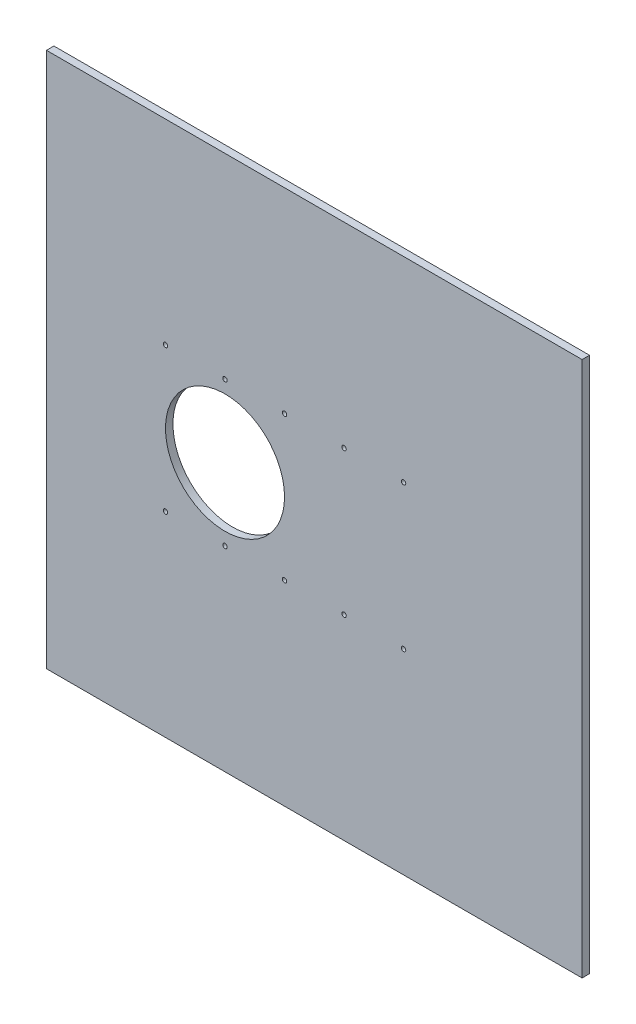
ISO-10303-21;
HEADER;
FILE_DESCRIPTION(('STEP AP214'),'2;1');
FILE_NAME('part.step','',(''),(''),'','','');
FILE_SCHEMA(('AUTOMOTIVE_DESIGN { 1 0 10303 214 1 1 1 1 }'));
ENDSEC;
DATA;
#1=APPLICATION_CONTEXT('core data for automotive mechanical design processes');
#2=APPLICATION_PROTOCOL_DEFINITION('international standard','automotive_design',2000,#1);
#3=PRODUCT_CONTEXT('',#1,'mechanical');
#4=PRODUCT('Part','Part','',(#3));
#5=PRODUCT_RELATED_PRODUCT_CATEGORY('part','',(#4));
#6=PRODUCT_DEFINITION_FORMATION('','',#4);
#7=PRODUCT_DEFINITION_CONTEXT('part definition',#1,'design');
#8=PRODUCT_DEFINITION('design','',#6,#7);
#9=PRODUCT_DEFINITION_SHAPE('','',#8);
#10=(LENGTH_UNIT() NAMED_UNIT(*) SI_UNIT(.MILLI.,.METRE.));
#11=(NAMED_UNIT(*) PLANE_ANGLE_UNIT() SI_UNIT($,.RADIAN.));
#12=(NAMED_UNIT(*) SI_UNIT($,.STERADIAN.) SOLID_ANGLE_UNIT());
#13=UNCERTAINTY_MEASURE_WITH_UNIT(LENGTH_MEASURE(1.E-05),#10,'distance_accuracy_value','');
#14=(GEOMETRIC_REPRESENTATION_CONTEXT(3) GLOBAL_UNCERTAINTY_ASSIGNED_CONTEXT((#13)) GLOBAL_UNIT_ASSIGNED_CONTEXT((#10,
#11,#12)) REPRESENTATION_CONTEXT('',''));
#15=CARTESIAN_POINT('',(0.,0.,0.));
#16=DIRECTION('',(0.,0.,1.));
#17=DIRECTION('',(1.,0.,0.));
#18=AXIS2_PLACEMENT_3D('',#15,#16,#17);
#19=CARTESIAN_POINT('',(0.,0.,6.35));
#20=DIRECTION('',(0.,0.,-1.));
#21=DIRECTION('',(-1.,0.,0.));
#22=AXIS2_PLACEMENT_3D('',#19,#20,#21);
#23=PLANE('',#22);
#24=CARTESIAN_POINT('',(101.6,290.195,6.35));
#25=DIRECTION('',(0.,0.,-1.));
#26=DIRECTION('',(-1.,0.,0.));
#27=AXIS2_PLACEMENT_3D('',#24,#25,#26);
#28=CIRCLE('',#27,1.89865);
#29=CARTESIAN_POINT('',(99.70135,290.195,6.35));
#30=VERTEX_POINT('',#29);
#31=EDGE_CURVE('E244',#30,#30,#28,.T.);
#32=ORIENTED_EDGE('',*,*,#31,.T.);
#33=EDGE_LOOP('',(#32));
#34=FACE_BOUND('',#33,.T.);
#35=CARTESIAN_POINT('',(152.4,290.195,6.35));
#36=DIRECTION('',(0.,0.,-1.));
#37=DIRECTION('',(-1.,0.,0.));
#38=AXIS2_PLACEMENT_3D('',#35,#36,#37);
#39=CIRCLE('',#38,1.89865);
#40=CARTESIAN_POINT('',(150.50135,290.195,6.35));
#41=VERTEX_POINT('',#40);
#42=EDGE_CURVE('E232',#41,#41,#39,.T.);
#43=ORIENTED_EDGE('',*,*,#42,.T.);
#44=EDGE_LOOP('',(#43));
#45=FACE_BOUND('',#44,.T.);
#46=CARTESIAN_POINT('',(203.2,290.195,6.35));
#47=DIRECTION('',(0.,0.,-1.));
#48=DIRECTION('',(-1.,0.,0.));
#49=AXIS2_PLACEMENT_3D('',#46,#47,#48);
#50=CIRCLE('',#49,1.89865);
#51=CARTESIAN_POINT('',(201.30135,290.195,6.35));
#52=VERTEX_POINT('',#51);
#53=EDGE_CURVE('E220',#52,#52,#50,.T.);
#54=ORIENTED_EDGE('',*,*,#53,.T.);
#55=EDGE_LOOP('',(#54));
#56=FACE_BOUND('',#55,.T.);
#57=CARTESIAN_POINT('',(203.2,167.005,6.35));
#58=DIRECTION('',(0.,0.,-1.));
#59=DIRECTION('',(-1.,0.,0.));
#60=AXIS2_PLACEMENT_3D('',#57,#58,#59);
#61=CIRCLE('',#60,1.89865);
#62=CARTESIAN_POINT('',(201.30135,167.005,6.35));
#63=VERTEX_POINT('',#62);
#64=EDGE_CURVE('E208',#63,#63,#61,.T.);
#65=ORIENTED_EDGE('',*,*,#64,.T.);
#66=EDGE_LOOP('',(#65));
#67=FACE_BOUND('',#66,.T.);
#68=CARTESIAN_POINT('',(152.4,167.005,6.35));
#69=DIRECTION('',(0.,0.,-1.));
#70=DIRECTION('',(-1.,0.,0.));
#71=AXIS2_PLACEMENT_3D('',#68,#69,#70);
#72=CIRCLE('',#71,1.89865);
#73=CARTESIAN_POINT('',(150.50135,167.005,6.35));
#74=VERTEX_POINT('',#73);
#75=EDGE_CURVE('E196',#74,#74,#72,.T.);
#76=ORIENTED_EDGE('',*,*,#75,.T.);
#77=EDGE_LOOP('',(#76));
#78=FACE_BOUND('',#77,.T.);
#79=CARTESIAN_POINT('',(101.6,167.005,6.35));
#80=DIRECTION('',(0.,0.,-1.));
#81=DIRECTION('',(-1.,0.,0.));
#82=AXIS2_PLACEMENT_3D('',#79,#80,#81);
#83=CIRCLE('',#82,1.89865);
#84=CARTESIAN_POINT('',(99.70135,167.005,6.35));
#85=VERTEX_POINT('',#84);
#86=EDGE_CURVE('E184',#85,#85,#83,.T.);
#87=ORIENTED_EDGE('',*,*,#86,.T.);
#88=EDGE_LOOP('',(#87));
#89=FACE_BOUND('',#88,.T.);
#90=CARTESIAN_POINT('',(254.,290.195,6.35));
#91=DIRECTION('',(0.,0.,-1.));
#92=DIRECTION('',(-1.,0.,0.));
#93=AXIS2_PLACEMENT_3D('',#90,#91,#92);
#94=CIRCLE('',#93,1.89865);
#95=CARTESIAN_POINT('',(252.10135,290.195,6.35));
#96=VERTEX_POINT('',#95);
#97=EDGE_CURVE('E172',#96,#96,#94,.T.);
#98=ORIENTED_EDGE('',*,*,#97,.T.);
#99=EDGE_LOOP('',(#98));
#100=FACE_BOUND('',#99,.T.);
#101=CARTESIAN_POINT('',(304.8,290.195,6.35));
#102=DIRECTION('',(0.,0.,-1.));
#103=DIRECTION('',(-1.,0.,0.));
#104=AXIS2_PLACEMENT_3D('',#101,#102,#103);
#105=CIRCLE('',#104,1.89865);
#106=CARTESIAN_POINT('',(302.90135,290.195,6.35));
#107=VERTEX_POINT('',#106);
#108=EDGE_CURVE('E160',#107,#107,#105,.T.);
#109=ORIENTED_EDGE('',*,*,#108,.T.);
#110=EDGE_LOOP('',(#109));
#111=FACE_BOUND('',#110,.T.);
#112=CARTESIAN_POINT('',(304.8,167.005,6.35));
#113=DIRECTION('',(0.,0.,-1.));
#114=DIRECTION('',(-1.,0.,0.));
#115=AXIS2_PLACEMENT_3D('',#112,#113,#114);
#116=CIRCLE('',#115,1.89865);
#117=CARTESIAN_POINT('',(302.90135,167.005,6.35));
#118=VERTEX_POINT('',#117);
#119=EDGE_CURVE('E148',#118,#118,#116,.T.);
#120=ORIENTED_EDGE('',*,*,#119,.T.);
#121=EDGE_LOOP('',(#120));
#122=FACE_BOUND('',#121,.T.);
#123=CARTESIAN_POINT('',(254.,167.005,6.35));
#124=DIRECTION('',(0.,0.,-1.));
#125=DIRECTION('',(-1.,0.,0.));
#126=AXIS2_PLACEMENT_3D('',#123,#124,#125);
#127=CIRCLE('',#126,1.89865);
#128=CARTESIAN_POINT('',(252.10135,167.005,6.35));
#129=VERTEX_POINT('',#128);
#130=EDGE_CURVE('E133',#129,#129,#127,.T.);
#131=ORIENTED_EDGE('',*,*,#130,.T.);
#132=EDGE_LOOP('',(#131));
#133=FACE_BOUND('',#132,.T.);
#134=DIRECTION('',(0.,-1.,0.));
#135=VECTOR('',#134,1.);
#136=CARTESIAN_POINT('',(0.,0.,6.35));
#137=LINE('',#136,#135);
#138=CARTESIAN_POINT('',(-1.11022302462516E-13,457.2,6.35));
#139=VERTEX_POINT('',#138);
#140=CARTESIAN_POINT('',(0.,0.,6.35));
#141=VERTEX_POINT('',#140);
#142=EDGE_CURVE('E91',#139,#141,#137,.T.);
#143=ORIENTED_EDGE('',*,*,#142,.T.);
#144=DIRECTION('',(1.,0.,0.));
#145=VECTOR('',#144,1.);
#146=CARTESIAN_POINT('',(0.,0.,6.35));
#147=LINE('',#146,#145);
#148=CARTESIAN_POINT('',(457.2,0.,6.35));
#149=VERTEX_POINT('',#148);
#150=EDGE_CURVE('E86',#141,#149,#147,.T.);
#151=ORIENTED_EDGE('',*,*,#150,.T.);
#152=DIRECTION('',(0.,1.,0.));
#153=VECTOR('',#152,1.);
#154=CARTESIAN_POINT('',(457.2,0.,6.35));
#155=LINE('',#154,#153);
#156=CARTESIAN_POINT('',(457.2,457.2,6.35));
#157=VERTEX_POINT('',#156);
#158=EDGE_CURVE('E89',#149,#157,#155,.T.);
#159=ORIENTED_EDGE('',*,*,#158,.T.);
#160=DIRECTION('',(-1.,0.,0.));
#161=VECTOR('',#160,1.);
#162=CARTESIAN_POINT('',(-1.11022302462516E-13,457.2,6.35));
#163=LINE('',#162,#161);
#164=EDGE_CURVE('E56',#157,#139,#163,.T.);
#165=ORIENTED_EDGE('',*,*,#164,.T.);
#166=EDGE_LOOP('',(#143,#151,#159,#165));
#167=FACE_BOUND('',#166,.T.);
#168=CARTESIAN_POINT('',(152.4,228.6,6.35));
#169=DIRECTION('',(0.,0.,1.));
#170=DIRECTION('',(1.,0.,0.));
#171=AXIS2_PLACEMENT_3D('',#168,#169,#170);
#172=CIRCLE('',#171,50.8);
#173=CARTESIAN_POINT('',(203.2,228.6,6.35));
#174=VERTEX_POINT('',#173);
#175=EDGE_CURVE('E111',#174,#174,#172,.T.);
#176=ORIENTED_EDGE('',*,*,#175,.F.);
#177=EDGE_LOOP('',(#176));
#178=FACE_BOUND('',#177,.T.);
#179=ADVANCED_FACE('F38',(#34,#45,#56,#67,#78,#89,#100,#111,#122,#133,#167,#178),#23,.F.);
#180=CARTESIAN_POINT('',(0.,0.,0.));
#181=DIRECTION('',(0.,0.,-1.));
#182=DIRECTION('',(-1.,0.,0.));
#183=AXIS2_PLACEMENT_3D('',#180,#181,#182);
#184=PLANE('',#183);
#185=CARTESIAN_POINT('',(101.6,290.195,0.));
#186=DIRECTION('',(0.,0.,-1.));
#187=DIRECTION('',(-1.,0.,0.));
#188=AXIS2_PLACEMENT_3D('',#185,#186,#187);
#189=CIRCLE('',#188,3.5433);
#190=CARTESIAN_POINT('',(98.0567,290.195,0.));
#191=VERTEX_POINT('',#190);
#192=EDGE_CURVE('E252',#191,#191,#189,.T.);
#193=ORIENTED_EDGE('',*,*,#192,.F.);
#194=EDGE_LOOP('',(#193));
#195=FACE_BOUND('',#194,.T.);
#196=CARTESIAN_POINT('',(152.4,290.195,0.));
#197=DIRECTION('',(0.,0.,-1.));
#198=DIRECTION('',(-1.,0.,0.));
#199=AXIS2_PLACEMENT_3D('',#196,#197,#198);
#200=CIRCLE('',#199,3.5433);
#201=CARTESIAN_POINT('',(148.8567,290.195,0.));
#202=VERTEX_POINT('',#201);
#203=EDGE_CURVE('E240',#202,#202,#200,.T.);
#204=ORIENTED_EDGE('',*,*,#203,.F.);
#205=EDGE_LOOP('',(#204));
#206=FACE_BOUND('',#205,.T.);
#207=CARTESIAN_POINT('',(203.2,290.195,0.));
#208=DIRECTION('',(0.,0.,-1.));
#209=DIRECTION('',(-1.,0.,0.));
#210=AXIS2_PLACEMENT_3D('',#207,#208,#209);
#211=CIRCLE('',#210,3.5433);
#212=CARTESIAN_POINT('',(199.6567,290.195,0.));
#213=VERTEX_POINT('',#212);
#214=EDGE_CURVE('E228',#213,#213,#211,.T.);
#215=ORIENTED_EDGE('',*,*,#214,.F.);
#216=EDGE_LOOP('',(#215));
#217=FACE_BOUND('',#216,.T.);
#218=CARTESIAN_POINT('',(203.2,167.005,0.));
#219=DIRECTION('',(0.,0.,-1.));
#220=DIRECTION('',(-1.,0.,0.));
#221=AXIS2_PLACEMENT_3D('',#218,#219,#220);
#222=CIRCLE('',#221,3.5433);
#223=CARTESIAN_POINT('',(199.6567,167.005,0.));
#224=VERTEX_POINT('',#223);
#225=EDGE_CURVE('E216',#224,#224,#222,.T.);
#226=ORIENTED_EDGE('',*,*,#225,.F.);
#227=EDGE_LOOP('',(#226));
#228=FACE_BOUND('',#227,.T.);
#229=CARTESIAN_POINT('',(152.4,167.005,0.));
#230=DIRECTION('',(0.,0.,-1.));
#231=DIRECTION('',(-1.,0.,0.));
#232=AXIS2_PLACEMENT_3D('',#229,#230,#231);
#233=CIRCLE('',#232,3.5433);
#234=CARTESIAN_POINT('',(148.8567,167.005,0.));
#235=VERTEX_POINT('',#234);
#236=EDGE_CURVE('E204',#235,#235,#233,.T.);
#237=ORIENTED_EDGE('',*,*,#236,.F.);
#238=EDGE_LOOP('',(#237));
#239=FACE_BOUND('',#238,.T.);
#240=CARTESIAN_POINT('',(101.6,167.005,0.));
#241=DIRECTION('',(0.,0.,-1.));
#242=DIRECTION('',(-1.,0.,0.));
#243=AXIS2_PLACEMENT_3D('',#240,#241,#242);
#244=CIRCLE('',#243,3.5433);
#245=CARTESIAN_POINT('',(98.0567,167.005,0.));
#246=VERTEX_POINT('',#245);
#247=EDGE_CURVE('E192',#246,#246,#244,.T.);
#248=ORIENTED_EDGE('',*,*,#247,.F.);
#249=EDGE_LOOP('',(#248));
#250=FACE_BOUND('',#249,.T.);
#251=CARTESIAN_POINT('',(254.,290.195,0.));
#252=DIRECTION('',(0.,0.,-1.));
#253=DIRECTION('',(-1.,0.,0.));
#254=AXIS2_PLACEMENT_3D('',#251,#252,#253);
#255=CIRCLE('',#254,3.54330000000003);
#256=CARTESIAN_POINT('',(250.4567,290.195,0.));
#257=VERTEX_POINT('',#256);
#258=EDGE_CURVE('E180',#257,#257,#255,.T.);
#259=ORIENTED_EDGE('',*,*,#258,.F.);
#260=EDGE_LOOP('',(#259));
#261=FACE_BOUND('',#260,.T.);
#262=CARTESIAN_POINT('',(304.8,290.195,0.));
#263=DIRECTION('',(0.,0.,-1.));
#264=DIRECTION('',(-1.,0.,0.));
#265=AXIS2_PLACEMENT_3D('',#262,#263,#264);
#266=CIRCLE('',#265,3.54329999999997);
#267=CARTESIAN_POINT('',(301.2567,290.195,0.));
#268=VERTEX_POINT('',#267);
#269=EDGE_CURVE('E168',#268,#268,#266,.T.);
#270=ORIENTED_EDGE('',*,*,#269,.F.);
#271=EDGE_LOOP('',(#270));
#272=FACE_BOUND('',#271,.T.);
#273=CARTESIAN_POINT('',(304.8,167.005,0.));
#274=DIRECTION('',(0.,0.,-1.));
#275=DIRECTION('',(-1.,0.,0.));
#276=AXIS2_PLACEMENT_3D('',#273,#274,#275);
#277=CIRCLE('',#276,3.54329999999997);
#278=CARTESIAN_POINT('',(301.2567,167.005,0.));
#279=VERTEX_POINT('',#278);
#280=EDGE_CURVE('E156',#279,#279,#277,.T.);
#281=ORIENTED_EDGE('',*,*,#280,.F.);
#282=EDGE_LOOP('',(#281));
#283=FACE_BOUND('',#282,.T.);
#284=CARTESIAN_POINT('',(254.,167.005,0.));
#285=DIRECTION('',(0.,0.,-1.));
#286=DIRECTION('',(-1.,0.,0.));
#287=AXIS2_PLACEMENT_3D('',#284,#285,#286);
#288=CIRCLE('',#287,3.54330000000003);
#289=CARTESIAN_POINT('',(250.4567,167.005,0.));
#290=VERTEX_POINT('',#289);
#291=EDGE_CURVE('E144',#290,#290,#288,.T.);
#292=ORIENTED_EDGE('',*,*,#291,.F.);
#293=EDGE_LOOP('',(#292));
#294=FACE_BOUND('',#293,.T.);
#295=DIRECTION('',(0.,-1.,0.));
#296=VECTOR('',#295,1.);
#297=CARTESIAN_POINT('',(0.,0.,0.));
#298=LINE('',#297,#296);
#299=CARTESIAN_POINT('',(-1.11022302462516E-13,457.2,0.));
#300=VERTEX_POINT('',#299);
#301=CARTESIAN_POINT('',(0.,0.,0.));
#302=VERTEX_POINT('',#301);
#303=EDGE_CURVE('E107',#300,#302,#298,.T.);
#304=ORIENTED_EDGE('',*,*,#303,.F.);
#305=DIRECTION('',(-1.,0.,0.));
#306=VECTOR('',#305,1.);
#307=CARTESIAN_POINT('',(-1.11022302462516E-13,457.2,0.));
#308=LINE('',#307,#306);
#309=CARTESIAN_POINT('',(457.2,457.2,0.));
#310=VERTEX_POINT('',#309);
#311=EDGE_CURVE('E79',#310,#300,#308,.T.);
#312=ORIENTED_EDGE('',*,*,#311,.F.);
#313=DIRECTION('',(0.,1.,0.));
#314=VECTOR('',#313,1.);
#315=CARTESIAN_POINT('',(457.2,0.,0.));
#316=LINE('',#315,#314);
#317=CARTESIAN_POINT('',(457.2,0.,0.));
#318=VERTEX_POINT('',#317);
#319=EDGE_CURVE('E73',#318,#310,#316,.T.);
#320=ORIENTED_EDGE('',*,*,#319,.F.);
#321=DIRECTION('',(1.,0.,0.));
#322=VECTOR('',#321,1.);
#323=CARTESIAN_POINT('',(0.,0.,0.));
#324=LINE('',#323,#322);
#325=EDGE_CURVE('E96',#302,#318,#324,.T.);
#326=ORIENTED_EDGE('',*,*,#325,.F.);
#327=EDGE_LOOP('',(#304,#312,#320,#326));
#328=FACE_BOUND('',#327,.T.);
#329=CARTESIAN_POINT('',(152.4,228.6,0.));
#330=DIRECTION('',(0.,0.,1.));
#331=DIRECTION('',(1.,0.,0.));
#332=AXIS2_PLACEMENT_3D('',#329,#330,#331);
#333=CIRCLE('',#332,50.8);
#334=CARTESIAN_POINT('',(203.2,228.6,0.));
#335=VERTEX_POINT('',#334);
#336=EDGE_CURVE('E129',#335,#335,#333,.T.);
#337=ORIENTED_EDGE('',*,*,#336,.T.);
#338=EDGE_LOOP('',(#337));
#339=FACE_BOUND('',#338,.T.);
#340=ADVANCED_FACE('F124',(#195,#206,#217,#228,#239,#250,#261,#272,#283,#294,#328,#339),#184,.T.);
#341=CARTESIAN_POINT('',(0.,0.,6.35));
#342=DIRECTION('',(1.,0.,0.));
#343=DIRECTION('',(0.,1.,0.));
#344=AXIS2_PLACEMENT_3D('',#341,#342,#343);
#345=PLANE('',#344);
#346=ORIENTED_EDGE('',*,*,#303,.T.);
#347=DIRECTION('',(0.,0.,-1.));
#348=VECTOR('',#347,1.);
#349=CARTESIAN_POINT('',(0.,0.,6.35));
#350=LINE('',#349,#348);
#351=EDGE_CURVE('E11',#141,#302,#350,.T.);
#352=ORIENTED_EDGE('',*,*,#351,.F.);
#353=ORIENTED_EDGE('',*,*,#142,.F.);
#354=DIRECTION('',(0.,0.,-1.));
#355=VECTOR('',#354,1.);
#356=CARTESIAN_POINT('',(-1.11022302462516E-13,457.2,6.35));
#357=LINE('',#356,#355);
#358=EDGE_CURVE('E103',#139,#300,#357,.T.);
#359=ORIENTED_EDGE('',*,*,#358,.T.);
#360=EDGE_LOOP('',(#346,#352,#353,#359));
#361=FACE_BOUND('',#360,.T.);
#362=ADVANCED_FACE('F40',(#361),#345,.F.);
#363=CARTESIAN_POINT('',(0.,0.,6.35));
#364=DIRECTION('',(0.,1.,0.));
#365=DIRECTION('',(0.,0.,1.));
#366=AXIS2_PLACEMENT_3D('',#363,#364,#365);
#367=PLANE('',#366);
#368=ORIENTED_EDGE('',*,*,#325,.T.);
#369=DIRECTION('',(0.,0.,-1.));
#370=VECTOR('',#369,1.);
#371=CARTESIAN_POINT('',(457.2,0.,6.35));
#372=LINE('',#371,#370);
#373=EDGE_CURVE('E48',#149,#318,#372,.T.);
#374=ORIENTED_EDGE('',*,*,#373,.F.);
#375=ORIENTED_EDGE('',*,*,#150,.F.);
#376=ORIENTED_EDGE('',*,*,#351,.T.);
#377=EDGE_LOOP('',(#368,#374,#375,#376));
#378=FACE_BOUND('',#377,.T.);
#379=ADVANCED_FACE('F95',(#378),#367,.F.);
#380=CARTESIAN_POINT('',(457.2,0.,6.35));
#381=DIRECTION('',(-1.,0.,0.));
#382=DIRECTION('',(0.,-1.,0.));
#383=AXIS2_PLACEMENT_3D('',#380,#381,#382);
#384=PLANE('',#383);
#385=ORIENTED_EDGE('',*,*,#319,.T.);
#386=DIRECTION('',(0.,0.,-1.));
#387=VECTOR('',#386,1.);
#388=CARTESIAN_POINT('',(457.2,457.2,6.35));
#389=LINE('',#388,#387);
#390=EDGE_CURVE('E98',#157,#310,#389,.T.);
#391=ORIENTED_EDGE('',*,*,#390,.F.);
#392=ORIENTED_EDGE('',*,*,#158,.F.);
#393=ORIENTED_EDGE('',*,*,#373,.T.);
#394=EDGE_LOOP('',(#385,#391,#392,#393));
#395=FACE_BOUND('',#394,.T.);
#396=ADVANCED_FACE('F99',(#395),#384,.F.);
#397=CARTESIAN_POINT('',(-1.11022302462516E-13,457.2,6.35));
#398=DIRECTION('',(0.,-1.,0.));
#399=DIRECTION('',(0.,0.,-1.));
#400=AXIS2_PLACEMENT_3D('',#397,#398,#399);
#401=PLANE('',#400);
#402=ORIENTED_EDGE('',*,*,#311,.T.);
#403=ORIENTED_EDGE('',*,*,#358,.F.);
#404=ORIENTED_EDGE('',*,*,#164,.F.);
#405=ORIENTED_EDGE('',*,*,#390,.T.);
#406=EDGE_LOOP('',(#402,#403,#404,#405));
#407=FACE_BOUND('',#406,.T.);
#408=ADVANCED_FACE('F121',(#407),#401,.F.);
#409=CARTESIAN_POINT('',(152.4,228.6,6.35));
#410=DIRECTION('',(0.,0.,-1.));
#411=DIRECTION('',(-1.,0.,0.));
#412=AXIS2_PLACEMENT_3D('',#409,#410,#411);
#413=CYLINDRICAL_SURFACE('',#412,50.8);
#414=ORIENTED_EDGE('',*,*,#175,.T.);
#415=EDGE_LOOP('',(#414));
#416=FACE_BOUND('',#415,.T.);
#417=ORIENTED_EDGE('',*,*,#336,.F.);
#418=EDGE_LOOP('',(#417));
#419=FACE_BOUND('',#418,.T.);
#420=ADVANCED_FACE('F293',(#416,#419),#413,.F.);
#421=CARTESIAN_POINT('',(254.,167.005,0.));
#422=DIRECTION('',(0.,0.,-1.));
#423=DIRECTION('',(-1.,0.,0.));
#424=AXIS2_PLACEMENT_3D('',#421,#422,#423);
#425=CYLINDRICAL_SURFACE('',#424,1.89865);
#426=ORIENTED_EDGE('',*,*,#130,.F.);
#427=EDGE_LOOP('',(#426));
#428=FACE_BOUND('',#427,.T.);
#429=CARTESIAN_POINT('',(254.,167.005,1.38002520841572));
#430=DIRECTION('',(0.,0.,-1.));
#431=DIRECTION('',(-1.,0.,0.));
#432=AXIS2_PLACEMENT_3D('',#429,#430,#431);
#433=CIRCLE('',#432,1.89865);
#434=CARTESIAN_POINT('',(252.10135,167.005,1.38002520841572));
#435=VERTEX_POINT('',#434);
#436=EDGE_CURVE('E140',#435,#435,#433,.T.);
#437=ORIENTED_EDGE('',*,*,#436,.T.);
#438=EDGE_LOOP('',(#437));
#439=FACE_BOUND('',#438,.T.);
#440=ADVANCED_FACE('F283',(#428,#439),#425,.F.);
#441=CARTESIAN_POINT('',(254.,167.005,0.));
#442=DIRECTION('',(0.,0.,-1.));
#443=DIRECTION('',(-1.,0.,0.));
#444=AXIS2_PLACEMENT_3D('',#441,#442,#443);
#445=CONICAL_SURFACE('',#444,3.54330000000003,0.872664625997171);
#446=ORIENTED_EDGE('',*,*,#436,.F.);
#447=EDGE_LOOP('',(#446));
#448=FACE_BOUND('',#447,.T.);
#449=ORIENTED_EDGE('',*,*,#291,.T.);
#450=EDGE_LOOP('',(#449));
#451=FACE_BOUND('',#450,.T.);
#452=ADVANCED_FACE('F280',(#448,#451),#445,.F.);
#453=CARTESIAN_POINT('',(304.8,167.005,0.));
#454=DIRECTION('',(0.,0.,-1.));
#455=DIRECTION('',(-1.,0.,0.));
#456=AXIS2_PLACEMENT_3D('',#453,#454,#455);
#457=CYLINDRICAL_SURFACE('',#456,1.89865);
#458=ORIENTED_EDGE('',*,*,#119,.F.);
#459=EDGE_LOOP('',(#458));
#460=FACE_BOUND('',#459,.T.);
#461=CARTESIAN_POINT('',(304.8,167.005,1.38002520841572));
#462=DIRECTION('',(0.,0.,-1.));
#463=DIRECTION('',(-1.,0.,0.));
#464=AXIS2_PLACEMENT_3D('',#461,#462,#463);
#465=CIRCLE('',#464,1.89865);
#466=CARTESIAN_POINT('',(302.90135,167.005,1.38002520841572));
#467=VERTEX_POINT('',#466);
#468=EDGE_CURVE('E152',#467,#467,#465,.T.);
#469=ORIENTED_EDGE('',*,*,#468,.T.);
#470=EDGE_LOOP('',(#469));
#471=FACE_BOUND('',#470,.T.);
#472=ADVANCED_FACE('F282',(#460,#471),#457,.F.);
#473=CARTESIAN_POINT('',(304.8,167.005,0.));
#474=DIRECTION('',(0.,0.,-1.));
#475=DIRECTION('',(-1.,0.,0.));
#476=AXIS2_PLACEMENT_3D('',#473,#474,#475);
#477=CONICAL_SURFACE('',#476,3.54329999999997,0.872664625997155);
#478=ORIENTED_EDGE('',*,*,#468,.F.);
#479=EDGE_LOOP('',(#478));
#480=FACE_BOUND('',#479,.T.);
#481=ORIENTED_EDGE('',*,*,#280,.T.);
#482=EDGE_LOOP('',(#481));
#483=FACE_BOUND('',#482,.T.);
#484=ADVANCED_FACE('F290',(#480,#483),#477,.F.);
#485=CARTESIAN_POINT('',(304.8,290.195,0.));
#486=DIRECTION('',(0.,0.,-1.));
#487=DIRECTION('',(-1.,0.,0.));
#488=AXIS2_PLACEMENT_3D('',#485,#486,#487);
#489=CYLINDRICAL_SURFACE('',#488,1.89865);
#490=ORIENTED_EDGE('',*,*,#108,.F.);
#491=EDGE_LOOP('',(#490));
#492=FACE_BOUND('',#491,.T.);
#493=CARTESIAN_POINT('',(304.8,290.195,1.38002520841572));
#494=DIRECTION('',(0.,0.,-1.));
#495=DIRECTION('',(-1.,0.,0.));
#496=AXIS2_PLACEMENT_3D('',#493,#494,#495);
#497=CIRCLE('',#496,1.89865);
#498=CARTESIAN_POINT('',(302.90135,290.195,1.38002520841572));
#499=VERTEX_POINT('',#498);
#500=EDGE_CURVE('E164',#499,#499,#497,.T.);
#501=ORIENTED_EDGE('',*,*,#500,.T.);
#502=EDGE_LOOP('',(#501));
#503=FACE_BOUND('',#502,.T.);
#504=ADVANCED_FACE('F348',(#492,#503),#489,.F.);
#505=CARTESIAN_POINT('',(304.8,290.195,0.));
#506=DIRECTION('',(0.,0.,-1.));
#507=DIRECTION('',(-1.,0.,0.));
#508=AXIS2_PLACEMENT_3D('',#505,#506,#507);
#509=CONICAL_SURFACE('',#508,3.54329999999997,0.872664625997155);
#510=ORIENTED_EDGE('',*,*,#500,.F.);
#511=EDGE_LOOP('',(#510));
#512=FACE_BOUND('',#511,.T.);
#513=ORIENTED_EDGE('',*,*,#269,.T.);
#514=EDGE_LOOP('',(#513));
#515=FACE_BOUND('',#514,.T.);
#516=ADVANCED_FACE('F358',(#512,#515),#509,.F.);
#517=CARTESIAN_POINT('',(254.,290.195,0.));
#518=DIRECTION('',(0.,0.,-1.));
#519=DIRECTION('',(-1.,0.,0.));
#520=AXIS2_PLACEMENT_3D('',#517,#518,#519);
#521=CYLINDRICAL_SURFACE('',#520,1.89865);
#522=ORIENTED_EDGE('',*,*,#97,.F.);
#523=EDGE_LOOP('',(#522));
#524=FACE_BOUND('',#523,.T.);
#525=CARTESIAN_POINT('',(254.,290.195,1.38002520841572));
#526=DIRECTION('',(0.,0.,-1.));
#527=DIRECTION('',(-1.,0.,0.));
#528=AXIS2_PLACEMENT_3D('',#525,#526,#527);
#529=CIRCLE('',#528,1.89865);
#530=CARTESIAN_POINT('',(252.10135,290.195,1.38002520841572));
#531=VERTEX_POINT('',#530);
#532=EDGE_CURVE('E176',#531,#531,#529,.T.);
#533=ORIENTED_EDGE('',*,*,#532,.T.);
#534=EDGE_LOOP('',(#533));
#535=FACE_BOUND('',#534,.T.);
#536=ADVANCED_FACE('F368',(#524,#535),#521,.F.);
#537=CARTESIAN_POINT('',(254.,290.195,0.));
#538=DIRECTION('',(0.,0.,-1.));
#539=DIRECTION('',(-1.,0.,0.));
#540=AXIS2_PLACEMENT_3D('',#537,#538,#539);
#541=CONICAL_SURFACE('',#540,3.54330000000003,0.872664625997171);
#542=ORIENTED_EDGE('',*,*,#532,.F.);
#543=EDGE_LOOP('',(#542));
#544=FACE_BOUND('',#543,.T.);
#545=ORIENTED_EDGE('',*,*,#258,.T.);
#546=EDGE_LOOP('',(#545));
#547=FACE_BOUND('',#546,.T.);
#548=ADVANCED_FACE('F378',(#544,#547),#541,.F.);
#549=CARTESIAN_POINT('',(101.6,167.005,0.));
#550=DIRECTION('',(0.,0.,-1.));
#551=DIRECTION('',(-1.,0.,0.));
#552=AXIS2_PLACEMENT_3D('',#549,#550,#551);
#553=CYLINDRICAL_SURFACE('',#552,1.89865);
#554=ORIENTED_EDGE('',*,*,#86,.F.);
#555=EDGE_LOOP('',(#554));
#556=FACE_BOUND('',#555,.T.);
#557=CARTESIAN_POINT('',(101.6,167.005,1.38002520841572));
#558=DIRECTION('',(0.,0.,-1.));
#559=DIRECTION('',(-1.,0.,0.));
#560=AXIS2_PLACEMENT_3D('',#557,#558,#559);
#561=CIRCLE('',#560,1.89865);
#562=CARTESIAN_POINT('',(99.70135,167.005,1.38002520841572));
#563=VERTEX_POINT('',#562);
#564=EDGE_CURVE('E188',#563,#563,#561,.T.);
#565=ORIENTED_EDGE('',*,*,#564,.T.);
#566=EDGE_LOOP('',(#565));
#567=FACE_BOUND('',#566,.T.);
#568=ADVANCED_FACE('F388',(#556,#567),#553,.F.);
#569=CARTESIAN_POINT('',(101.6,167.005,0.));
#570=DIRECTION('',(0.,0.,-1.));
#571=DIRECTION('',(-1.,0.,0.));
#572=AXIS2_PLACEMENT_3D('',#569,#570,#571);
#573=CONICAL_SURFACE('',#572,3.5433,0.872664625997163);
#574=ORIENTED_EDGE('',*,*,#564,.F.);
#575=EDGE_LOOP('',(#574));
#576=FACE_BOUND('',#575,.T.);
#577=ORIENTED_EDGE('',*,*,#247,.T.);
#578=EDGE_LOOP('',(#577));
#579=FACE_BOUND('',#578,.T.);
#580=ADVANCED_FACE('F398',(#576,#579),#573,.F.);
#581=CARTESIAN_POINT('',(152.4,167.005,0.));
#582=DIRECTION('',(0.,0.,-1.));
#583=DIRECTION('',(-1.,0.,0.));
#584=AXIS2_PLACEMENT_3D('',#581,#582,#583);
#585=CYLINDRICAL_SURFACE('',#584,1.89865);
#586=ORIENTED_EDGE('',*,*,#75,.F.);
#587=EDGE_LOOP('',(#586));
#588=FACE_BOUND('',#587,.T.);
#589=CARTESIAN_POINT('',(152.4,167.005,1.38002520841572));
#590=DIRECTION('',(0.,0.,-1.));
#591=DIRECTION('',(-1.,0.,0.));
#592=AXIS2_PLACEMENT_3D('',#589,#590,#591);
#593=CIRCLE('',#592,1.89865);
#594=CARTESIAN_POINT('',(150.50135,167.005,1.38002520841572));
#595=VERTEX_POINT('',#594);
#596=EDGE_CURVE('E200',#595,#595,#593,.T.);
#597=ORIENTED_EDGE('',*,*,#596,.T.);
#598=EDGE_LOOP('',(#597));
#599=FACE_BOUND('',#598,.T.);
#600=ADVANCED_FACE('F408',(#588,#599),#585,.F.);
#601=CARTESIAN_POINT('',(152.4,167.005,0.));
#602=DIRECTION('',(0.,0.,-1.));
#603=DIRECTION('',(-1.,0.,0.));
#604=AXIS2_PLACEMENT_3D('',#601,#602,#603);
#605=CONICAL_SURFACE('',#604,3.5433,0.872664625997163);
#606=ORIENTED_EDGE('',*,*,#596,.F.);
#607=EDGE_LOOP('',(#606));
#608=FACE_BOUND('',#607,.T.);
#609=ORIENTED_EDGE('',*,*,#236,.T.);
#610=EDGE_LOOP('',(#609));
#611=FACE_BOUND('',#610,.T.);
#612=ADVANCED_FACE('F418',(#608,#611),#605,.F.);
#613=CARTESIAN_POINT('',(203.2,167.005,0.));
#614=DIRECTION('',(0.,0.,-1.));
#615=DIRECTION('',(-1.,0.,0.));
#616=AXIS2_PLACEMENT_3D('',#613,#614,#615);
#617=CYLINDRICAL_SURFACE('',#616,1.89865);
#618=ORIENTED_EDGE('',*,*,#64,.F.);
#619=EDGE_LOOP('',(#618));
#620=FACE_BOUND('',#619,.T.);
#621=CARTESIAN_POINT('',(203.2,167.005,1.38002520841572));
#622=DIRECTION('',(0.,0.,-1.));
#623=DIRECTION('',(-1.,0.,0.));
#624=AXIS2_PLACEMENT_3D('',#621,#622,#623);
#625=CIRCLE('',#624,1.89865);
#626=CARTESIAN_POINT('',(201.30135,167.005,1.38002520841572));
#627=VERTEX_POINT('',#626);
#628=EDGE_CURVE('E212',#627,#627,#625,.T.);
#629=ORIENTED_EDGE('',*,*,#628,.T.);
#630=EDGE_LOOP('',(#629));
#631=FACE_BOUND('',#630,.T.);
#632=ADVANCED_FACE('F428',(#620,#631),#617,.F.);
#633=CARTESIAN_POINT('',(203.2,167.005,0.));
#634=DIRECTION('',(0.,0.,-1.));
#635=DIRECTION('',(-1.,0.,0.));
#636=AXIS2_PLACEMENT_3D('',#633,#634,#635);
#637=CONICAL_SURFACE('',#636,3.5433,0.872664625997163);
#638=ORIENTED_EDGE('',*,*,#628,.F.);
#639=EDGE_LOOP('',(#638));
#640=FACE_BOUND('',#639,.T.);
#641=ORIENTED_EDGE('',*,*,#225,.T.);
#642=EDGE_LOOP('',(#641));
#643=FACE_BOUND('',#642,.T.);
#644=ADVANCED_FACE('F438',(#640,#643),#637,.F.);
#645=CARTESIAN_POINT('',(203.2,290.195,0.));
#646=DIRECTION('',(0.,0.,-1.));
#647=DIRECTION('',(-1.,0.,0.));
#648=AXIS2_PLACEMENT_3D('',#645,#646,#647);
#649=CYLINDRICAL_SURFACE('',#648,1.89865);
#650=ORIENTED_EDGE('',*,*,#53,.F.);
#651=EDGE_LOOP('',(#650));
#652=FACE_BOUND('',#651,.T.);
#653=CARTESIAN_POINT('',(203.2,290.195,1.38002520841572));
#654=DIRECTION('',(0.,0.,-1.));
#655=DIRECTION('',(-1.,0.,0.));
#656=AXIS2_PLACEMENT_3D('',#653,#654,#655);
#657=CIRCLE('',#656,1.89865);
#658=CARTESIAN_POINT('',(201.30135,290.195,1.38002520841572));
#659=VERTEX_POINT('',#658);
#660=EDGE_CURVE('E224',#659,#659,#657,.T.);
#661=ORIENTED_EDGE('',*,*,#660,.T.);
#662=EDGE_LOOP('',(#661));
#663=FACE_BOUND('',#662,.T.);
#664=ADVANCED_FACE('F448',(#652,#663),#649,.F.);
#665=CARTESIAN_POINT('',(203.2,290.195,0.));
#666=DIRECTION('',(0.,0.,-1.));
#667=DIRECTION('',(-1.,0.,0.));
#668=AXIS2_PLACEMENT_3D('',#665,#666,#667);
#669=CONICAL_SURFACE('',#668,3.5433,0.872664625997163);
#670=ORIENTED_EDGE('',*,*,#660,.F.);
#671=EDGE_LOOP('',(#670));
#672=FACE_BOUND('',#671,.T.);
#673=ORIENTED_EDGE('',*,*,#214,.T.);
#674=EDGE_LOOP('',(#673));
#675=FACE_BOUND('',#674,.T.);
#676=ADVANCED_FACE('F458',(#672,#675),#669,.F.);
#677=CARTESIAN_POINT('',(152.4,290.195,0.));
#678=DIRECTION('',(0.,0.,-1.));
#679=DIRECTION('',(-1.,0.,0.));
#680=AXIS2_PLACEMENT_3D('',#677,#678,#679);
#681=CYLINDRICAL_SURFACE('',#680,1.89865);
#682=ORIENTED_EDGE('',*,*,#42,.F.);
#683=EDGE_LOOP('',(#682));
#684=FACE_BOUND('',#683,.T.);
#685=CARTESIAN_POINT('',(152.4,290.195,1.38002520841572));
#686=DIRECTION('',(0.,0.,-1.));
#687=DIRECTION('',(-1.,0.,0.));
#688=AXIS2_PLACEMENT_3D('',#685,#686,#687);
#689=CIRCLE('',#688,1.89865);
#690=CARTESIAN_POINT('',(150.50135,290.195,1.38002520841572));
#691=VERTEX_POINT('',#690);
#692=EDGE_CURVE('E236',#691,#691,#689,.T.);
#693=ORIENTED_EDGE('',*,*,#692,.T.);
#694=EDGE_LOOP('',(#693));
#695=FACE_BOUND('',#694,.T.);
#696=ADVANCED_FACE('F468',(#684,#695),#681,.F.);
#697=CARTESIAN_POINT('',(152.4,290.195,0.));
#698=DIRECTION('',(0.,0.,-1.));
#699=DIRECTION('',(-1.,0.,0.));
#700=AXIS2_PLACEMENT_3D('',#697,#698,#699);
#701=CONICAL_SURFACE('',#700,3.5433,0.872664625997163);
#702=ORIENTED_EDGE('',*,*,#692,.F.);
#703=EDGE_LOOP('',(#702));
#704=FACE_BOUND('',#703,.T.);
#705=ORIENTED_EDGE('',*,*,#203,.T.);
#706=EDGE_LOOP('',(#705));
#707=FACE_BOUND('',#706,.T.);
#708=ADVANCED_FACE('F478',(#704,#707),#701,.F.);
#709=CARTESIAN_POINT('',(101.6,290.195,0.));
#710=DIRECTION('',(0.,0.,-1.));
#711=DIRECTION('',(-1.,0.,0.));
#712=AXIS2_PLACEMENT_3D('',#709,#710,#711);
#713=CYLINDRICAL_SURFACE('',#712,1.89865);
#714=ORIENTED_EDGE('',*,*,#31,.F.);
#715=EDGE_LOOP('',(#714));
#716=FACE_BOUND('',#715,.T.);
#717=CARTESIAN_POINT('',(101.6,290.195,1.38002520841572));
#718=DIRECTION('',(0.,0.,-1.));
#719=DIRECTION('',(-1.,0.,0.));
#720=AXIS2_PLACEMENT_3D('',#717,#718,#719);
#721=CIRCLE('',#720,1.89865);
#722=CARTESIAN_POINT('',(99.70135,290.195,1.38002520841572));
#723=VERTEX_POINT('',#722);
#724=EDGE_CURVE('E248',#723,#723,#721,.T.);
#725=ORIENTED_EDGE('',*,*,#724,.T.);
#726=EDGE_LOOP('',(#725));
#727=FACE_BOUND('',#726,.T.);
#728=ADVANCED_FACE('F488',(#716,#727),#713,.F.);
#729=CARTESIAN_POINT('',(101.6,290.195,0.));
#730=DIRECTION('',(0.,0.,-1.));
#731=DIRECTION('',(-1.,0.,0.));
#732=AXIS2_PLACEMENT_3D('',#729,#730,#731);
#733=CONICAL_SURFACE('',#732,3.5433,0.872664625997163);
#734=ORIENTED_EDGE('',*,*,#724,.F.);
#735=EDGE_LOOP('',(#734));
#736=FACE_BOUND('',#735,.T.);
#737=ORIENTED_EDGE('',*,*,#192,.T.);
#738=EDGE_LOOP('',(#737));
#739=FACE_BOUND('',#738,.T.);
#740=ADVANCED_FACE('F257',(#736,#739),#733,.F.);
#741=CLOSED_SHELL('',(#179,#340,#362,#379,#396,#408,#420,#440,#452,#472,#484,#504,#516,#536,
#548,#568,#580,#600,#612,#632,#644,#664,#676,#696,#708,#728,#740));
#742=MANIFOLD_SOLID_BREP('B2',#741);
#743=ADVANCED_BREP_SHAPE_REPRESENTATION('',(#18,#742),#14);
#744=SHAPE_DEFINITION_REPRESENTATION(#9,#743);
ENDSEC;
END-ISO-10303-21;
